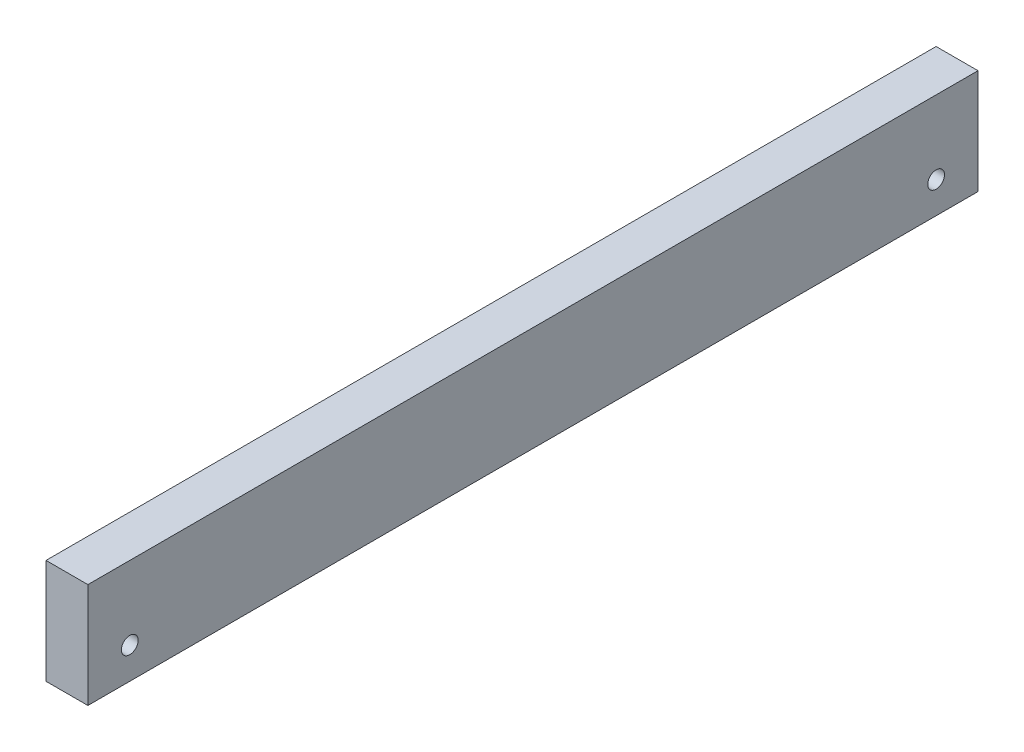
ISO-10303-21;
HEADER;
FILE_DESCRIPTION(('STEP AP214'),'2;1');
FILE_NAME('part.step','',(''),(''),'','','');
FILE_SCHEMA(('AUTOMOTIVE_DESIGN { 1 0 10303 214 1 1 1 1 }'));
ENDSEC;
DATA;
#1=APPLICATION_CONTEXT('core data for automotive mechanical design processes');
#2=APPLICATION_PROTOCOL_DEFINITION('international standard','automotive_design',2000,#1);
#3=PRODUCT_CONTEXT('',#1,'mechanical');
#4=PRODUCT('Part','Part','',(#3));
#5=PRODUCT_RELATED_PRODUCT_CATEGORY('part','',(#4));
#6=PRODUCT_DEFINITION_FORMATION('','',#4);
#7=PRODUCT_DEFINITION_CONTEXT('part definition',#1,'design');
#8=PRODUCT_DEFINITION('design','',#6,#7);
#9=PRODUCT_DEFINITION_SHAPE('','',#8);
#10=(LENGTH_UNIT() NAMED_UNIT(*) SI_UNIT(.MILLI.,.METRE.));
#11=(NAMED_UNIT(*) PLANE_ANGLE_UNIT() SI_UNIT($,.RADIAN.));
#12=(NAMED_UNIT(*) SI_UNIT($,.STERADIAN.) SOLID_ANGLE_UNIT());
#13=UNCERTAINTY_MEASURE_WITH_UNIT(LENGTH_MEASURE(1.E-05),#10,'distance_accuracy_value','');
#14=(GEOMETRIC_REPRESENTATION_CONTEXT(3) GLOBAL_UNCERTAINTY_ASSIGNED_CONTEXT((#13)) GLOBAL_UNIT_ASSIGNED_CONTEXT((#10,
#11,#12)) REPRESENTATION_CONTEXT('',''));
#15=CARTESIAN_POINT('',(0.,0.,0.));
#16=DIRECTION('',(0.,0.,1.));
#17=DIRECTION('',(1.,0.,0.));
#18=AXIS2_PLACEMENT_3D('',#15,#16,#17);
#19=CARTESIAN_POINT('',(0.,0.,425.));
#20=DIRECTION('',(1.,0.,0.));
#21=DIRECTION('',(0.,0.,-1.));
#22=AXIS2_PLACEMENT_3D('',#19,#20,#21);
#23=PLANE('',#22);
#24=CARTESIAN_POINT('',(0.,15.,405.));
#25=DIRECTION('',(1.,0.,0.));
#26=DIRECTION('',(0.,0.,-1.));
#27=AXIS2_PLACEMENT_3D('',#24,#25,#26);
#28=CIRCLE('',#27,4.);
#29=CARTESIAN_POINT('',(0.,15.,401.));
#30=VERTEX_POINT('',#29);
#31=EDGE_CURVE('E113',#30,#30,#28,.T.);
#32=ORIENTED_EDGE('',*,*,#31,.T.);
#33=EDGE_LOOP('',(#32));
#34=FACE_BOUND('',#33,.T.);
#35=CARTESIAN_POINT('',(0.,15.,20.));
#36=DIRECTION('',(1.,0.,0.));
#37=DIRECTION('',(0.,0.,-1.));
#38=AXIS2_PLACEMENT_3D('',#35,#36,#37);
#39=CIRCLE('',#38,4.);
#40=CARTESIAN_POINT('',(0.,15.,16.));
#41=VERTEX_POINT('',#40);
#42=EDGE_CURVE('E97',#41,#41,#39,.T.);
#43=ORIENTED_EDGE('',*,*,#42,.T.);
#44=EDGE_LOOP('',(#43));
#45=FACE_BOUND('',#44,.T.);
#46=DIRECTION('',(0.,-1.,0.));
#47=VECTOR('',#46,1.);
#48=CARTESIAN_POINT('',(0.,0.,0.));
#49=LINE('',#48,#47);
#50=CARTESIAN_POINT('',(0.,50.,0.));
#51=VERTEX_POINT('',#50);
#52=CARTESIAN_POINT('',(0.,0.,0.));
#53=VERTEX_POINT('',#52);
#54=EDGE_CURVE('E94',#51,#53,#49,.T.);
#55=ORIENTED_EDGE('',*,*,#54,.T.);
#56=DIRECTION('',(0.,0.,-1.));
#57=VECTOR('',#56,1.);
#58=CARTESIAN_POINT('',(0.,0.,425.));
#59=LINE('',#58,#57);
#60=CARTESIAN_POINT('',(0.,0.,425.));
#61=VERTEX_POINT('',#60);
#62=EDGE_CURVE('E11',#61,#53,#59,.T.);
#63=ORIENTED_EDGE('',*,*,#62,.F.);
#64=DIRECTION('',(0.,-1.,0.));
#65=VECTOR('',#64,1.);
#66=CARTESIAN_POINT('',(0.,0.,425.));
#67=LINE('',#66,#65);
#68=CARTESIAN_POINT('',(0.,50.,425.));
#69=VERTEX_POINT('',#68);
#70=EDGE_CURVE('E82',#69,#61,#67,.T.);
#71=ORIENTED_EDGE('',*,*,#70,.F.);
#72=DIRECTION('',(0.,0.,-1.));
#73=VECTOR('',#72,1.);
#74=CARTESIAN_POINT('',(0.,50.,425.));
#75=LINE('',#74,#73);
#76=EDGE_CURVE('E90',#69,#51,#75,.T.);
#77=ORIENTED_EDGE('',*,*,#76,.T.);
#78=EDGE_LOOP('',(#55,#63,#71,#77));
#79=FACE_BOUND('',#78,.T.);
#80=ADVANCED_FACE('F31',(#34,#45,#79),#23,.F.);
#81=CARTESIAN_POINT('',(0.,0.,425.));
#82=DIRECTION('',(0.,1.,0.));
#83=DIRECTION('',(0.,0.,1.));
#84=AXIS2_PLACEMENT_3D('',#81,#82,#83);
#85=PLANE('',#84);
#86=DIRECTION('',(1.,0.,0.));
#87=VECTOR('',#86,1.);
#88=CARTESIAN_POINT('',(0.,0.,0.));
#89=LINE('',#88,#87);
#90=CARTESIAN_POINT('',(20.,0.,0.));
#91=VERTEX_POINT('',#90);
#92=EDGE_CURVE('E86',#53,#91,#89,.T.);
#93=ORIENTED_EDGE('',*,*,#92,.T.);
#94=DIRECTION('',(0.,0.,-1.));
#95=VECTOR('',#94,1.);
#96=CARTESIAN_POINT('',(20.,0.,425.));
#97=LINE('',#96,#95);
#98=CARTESIAN_POINT('',(20.,0.,425.));
#99=VERTEX_POINT('',#98);
#100=EDGE_CURVE('E39',#99,#91,#97,.T.);
#101=ORIENTED_EDGE('',*,*,#100,.F.);
#102=DIRECTION('',(1.,0.,0.));
#103=VECTOR('',#102,1.);
#104=CARTESIAN_POINT('',(0.,0.,425.));
#105=LINE('',#104,#103);
#106=EDGE_CURVE('E77',#61,#99,#105,.T.);
#107=ORIENTED_EDGE('',*,*,#106,.F.);
#108=ORIENTED_EDGE('',*,*,#62,.T.);
#109=EDGE_LOOP('',(#93,#101,#107,#108));
#110=FACE_BOUND('',#109,.T.);
#111=ADVANCED_FACE('F85',(#110),#85,.F.);
#112=CARTESIAN_POINT('',(20.,0.,425.));
#113=DIRECTION('',(-1.,0.,0.));
#114=DIRECTION('',(0.,0.,1.));
#115=AXIS2_PLACEMENT_3D('',#112,#113,#114);
#116=PLANE('',#115);
#117=CARTESIAN_POINT('',(20.,15.,405.));
#118=DIRECTION('',(1.,0.,0.));
#119=DIRECTION('',(0.,0.,-1.));
#120=AXIS2_PLACEMENT_3D('',#117,#118,#119);
#121=CIRCLE('',#120,3.99999999999999);
#122=CARTESIAN_POINT('',(20.,15.,401.));
#123=VERTEX_POINT('',#122);
#124=EDGE_CURVE('E116',#123,#123,#121,.T.);
#125=ORIENTED_EDGE('',*,*,#124,.F.);
#126=EDGE_LOOP('',(#125));
#127=FACE_BOUND('',#126,.T.);
#128=CARTESIAN_POINT('',(20.,15.,20.));
#129=DIRECTION('',(1.,0.,0.));
#130=DIRECTION('',(0.,0.,-1.));
#131=AXIS2_PLACEMENT_3D('',#128,#129,#130);
#132=CIRCLE('',#131,3.99999999999999);
#133=CARTESIAN_POINT('',(20.,15.,16.));
#134=VERTEX_POINT('',#133);
#135=EDGE_CURVE('E110',#134,#134,#132,.T.);
#136=ORIENTED_EDGE('',*,*,#135,.F.);
#137=EDGE_LOOP('',(#136));
#138=FACE_BOUND('',#137,.T.);
#139=DIRECTION('',(0.,1.,0.));
#140=VECTOR('',#139,1.);
#141=CARTESIAN_POINT('',(20.,0.,0.));
#142=LINE('',#141,#140);
#143=CARTESIAN_POINT('',(20.,50.,0.));
#144=VERTEX_POINT('',#143);
#145=EDGE_CURVE('E64',#91,#144,#142,.T.);
#146=ORIENTED_EDGE('',*,*,#145,.T.);
#147=DIRECTION('',(0.,0.,-1.));
#148=VECTOR('',#147,1.);
#149=CARTESIAN_POINT('',(20.,50.,425.));
#150=LINE('',#149,#148);
#151=CARTESIAN_POINT('',(20.,50.,425.));
#152=VERTEX_POINT('',#151);
#153=EDGE_CURVE('E87',#152,#144,#150,.T.);
#154=ORIENTED_EDGE('',*,*,#153,.F.);
#155=DIRECTION('',(0.,1.,0.));
#156=VECTOR('',#155,1.);
#157=CARTESIAN_POINT('',(20.,0.,425.));
#158=LINE('',#157,#156);
#159=EDGE_CURVE('E80',#99,#152,#158,.T.);
#160=ORIENTED_EDGE('',*,*,#159,.F.);
#161=ORIENTED_EDGE('',*,*,#100,.T.);
#162=EDGE_LOOP('',(#146,#154,#160,#161));
#163=FACE_BOUND('',#162,.T.);
#164=ADVANCED_FACE('F88',(#127,#138,#163),#116,.F.);
#165=CARTESIAN_POINT('',(0.,50.,425.));
#166=DIRECTION('',(0.,-1.,0.));
#167=DIRECTION('',(0.,0.,-1.));
#168=AXIS2_PLACEMENT_3D('',#165,#166,#167);
#169=PLANE('',#168);
#170=DIRECTION('',(-1.,0.,0.));
#171=VECTOR('',#170,1.);
#172=CARTESIAN_POINT('',(0.,50.,0.));
#173=LINE('',#172,#171);
#174=EDGE_CURVE('E70',#144,#51,#173,.T.);
#175=ORIENTED_EDGE('',*,*,#174,.T.);
#176=ORIENTED_EDGE('',*,*,#76,.F.);
#177=DIRECTION('',(-1.,0.,0.));
#178=VECTOR('',#177,1.);
#179=CARTESIAN_POINT('',(0.,50.,425.));
#180=LINE('',#179,#178);
#181=EDGE_CURVE('E47',#152,#69,#180,.T.);
#182=ORIENTED_EDGE('',*,*,#181,.F.);
#183=ORIENTED_EDGE('',*,*,#153,.T.);
#184=EDGE_LOOP('',(#175,#176,#182,#183));
#185=FACE_BOUND('',#184,.T.);
#186=ADVANCED_FACE('F102',(#185),#169,.F.);
#187=CARTESIAN_POINT('',(0.,50.,425.));
#188=DIRECTION('',(0.,0.,-1.));
#189=DIRECTION('',(-1.,0.,0.));
#190=AXIS2_PLACEMENT_3D('',#187,#188,#189);
#191=PLANE('',#190);
#192=ORIENTED_EDGE('',*,*,#70,.T.);
#193=ORIENTED_EDGE('',*,*,#106,.T.);
#194=ORIENTED_EDGE('',*,*,#159,.T.);
#195=ORIENTED_EDGE('',*,*,#181,.T.);
#196=EDGE_LOOP('',(#192,#193,#194,#195));
#197=FACE_BOUND('',#196,.T.);
#198=ADVANCED_FACE('F78',(#197),#191,.F.);
#199=CARTESIAN_POINT('',(0.,50.,0.));
#200=DIRECTION('',(0.,0.,-1.));
#201=DIRECTION('',(-1.,0.,0.));
#202=AXIS2_PLACEMENT_3D('',#199,#200,#201);
#203=PLANE('',#202);
#204=ORIENTED_EDGE('',*,*,#54,.F.);
#205=ORIENTED_EDGE('',*,*,#174,.F.);
#206=ORIENTED_EDGE('',*,*,#145,.F.);
#207=ORIENTED_EDGE('',*,*,#92,.F.);
#208=EDGE_LOOP('',(#204,#205,#206,#207));
#209=FACE_BOUND('',#208,.T.);
#210=ADVANCED_FACE('F105',(#209),#203,.T.);
#211=CARTESIAN_POINT('',(20.,15.,20.));
#212=DIRECTION('',(1.,0.,0.));
#213=DIRECTION('',(0.,0.,-1.));
#214=AXIS2_PLACEMENT_3D('',#211,#212,#213);
#215=CYLINDRICAL_SURFACE('',#214,3.99999999999999);
#216=ORIENTED_EDGE('',*,*,#42,.F.);
#217=EDGE_LOOP('',(#216));
#218=FACE_BOUND('',#217,.T.);
#219=ORIENTED_EDGE('',*,*,#135,.T.);
#220=EDGE_LOOP('',(#219));
#221=FACE_BOUND('',#220,.T.);
#222=ADVANCED_FACE('F127',(#218,#221),#215,.F.);
#223=CARTESIAN_POINT('',(20.,15.,405.));
#224=DIRECTION('',(1.,0.,0.));
#225=DIRECTION('',(0.,0.,-1.));
#226=AXIS2_PLACEMENT_3D('',#223,#224,#225);
#227=CYLINDRICAL_SURFACE('',#226,3.99999999999999);
#228=ORIENTED_EDGE('',*,*,#31,.F.);
#229=EDGE_LOOP('',(#228));
#230=FACE_BOUND('',#229,.T.);
#231=ORIENTED_EDGE('',*,*,#124,.T.);
#232=EDGE_LOOP('',(#231));
#233=FACE_BOUND('',#232,.T.);
#234=ADVANCED_FACE('F120',(#230,#233),#227,.F.);
#235=CLOSED_SHELL('',(#80,#111,#164,#186,#198,#210,#222,#234));
#236=MANIFOLD_SOLID_BREP('B2',#235);
#237=ADVANCED_BREP_SHAPE_REPRESENTATION('',(#18,#236),#14);
#238=SHAPE_DEFINITION_REPRESENTATION(#9,#237);
ENDSEC;
END-ISO-10303-21;
